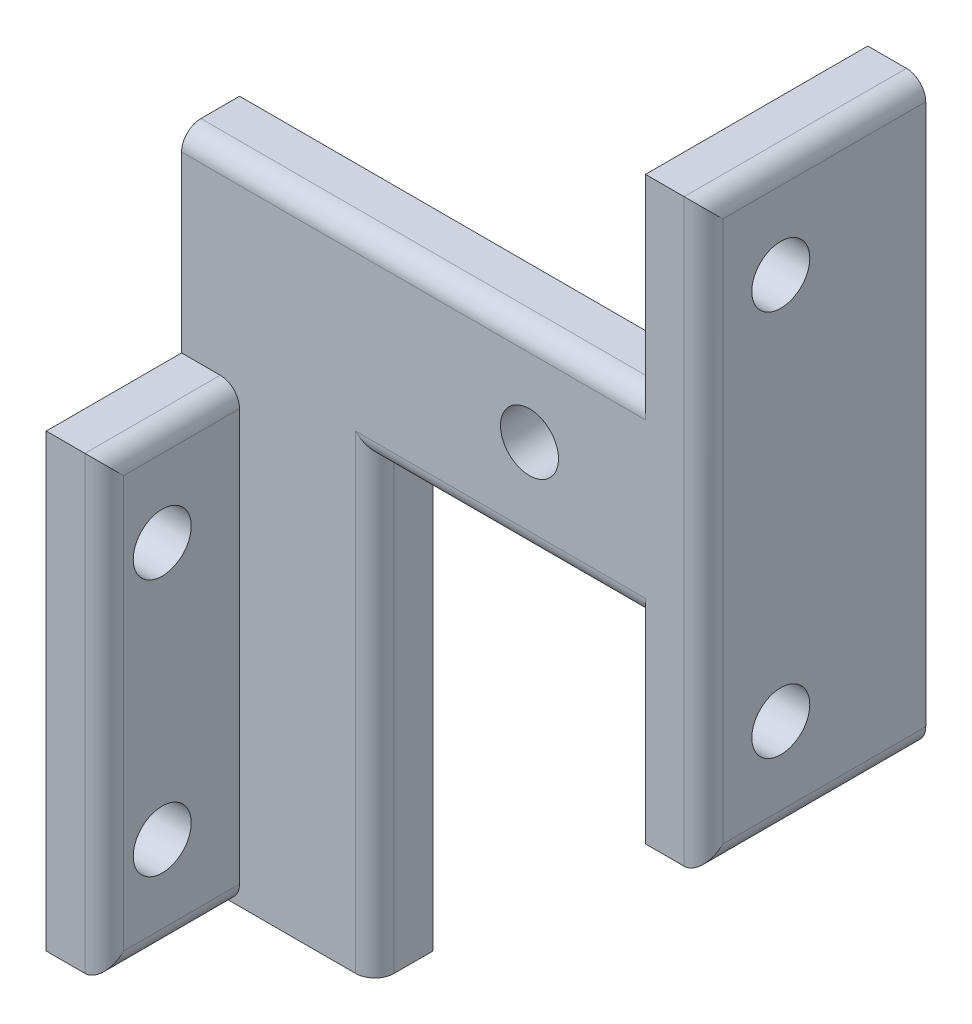
ISO-10303-21;
HEADER;
FILE_DESCRIPTION(('STEP AP214'),'2;1');
FILE_NAME('part.step','',(''),(''),'','','');
FILE_SCHEMA(('AUTOMOTIVE_DESIGN { 1 0 10303 214 1 1 1 1 }'));
ENDSEC;
DATA;
#1=APPLICATION_CONTEXT('core data for automotive mechanical design processes');
#2=APPLICATION_PROTOCOL_DEFINITION('international standard','automotive_design',2000,#1);
#3=PRODUCT_CONTEXT('',#1,'mechanical');
#4=PRODUCT('Part','Part','',(#3));
#5=PRODUCT_RELATED_PRODUCT_CATEGORY('part','',(#4));
#6=PRODUCT_DEFINITION_FORMATION('','',#4);
#7=PRODUCT_DEFINITION_CONTEXT('part definition',#1,'design');
#8=PRODUCT_DEFINITION('design','',#6,#7);
#9=PRODUCT_DEFINITION_SHAPE('','',#8);
#10=(LENGTH_UNIT() NAMED_UNIT(*) SI_UNIT(.MILLI.,.METRE.));
#11=(NAMED_UNIT(*) PLANE_ANGLE_UNIT() SI_UNIT($,.RADIAN.));
#12=(NAMED_UNIT(*) SI_UNIT($,.STERADIAN.) SOLID_ANGLE_UNIT());
#13=UNCERTAINTY_MEASURE_WITH_UNIT(LENGTH_MEASURE(1.E-05),#10,'distance_accuracy_value','');
#14=(GEOMETRIC_REPRESENTATION_CONTEXT(3) GLOBAL_UNCERTAINTY_ASSIGNED_CONTEXT((#13)) GLOBAL_UNIT_ASSIGNED_CONTEXT((#10,
#11,#12)) REPRESENTATION_CONTEXT('',''));
#15=CARTESIAN_POINT('',(0.,0.,0.));
#16=DIRECTION('',(0.,0.,1.));
#17=DIRECTION('',(1.,0.,0.));
#18=AXIS2_PLACEMENT_3D('',#15,#16,#17);
#19=CARTESIAN_POINT('',(7.,0.,23.));
#20=DIRECTION('',(0.,-1.,0.));
#21=DIRECTION('',(0.,0.,-1.));
#22=AXIS2_PLACEMENT_3D('',#19,#20,#21);
#23=PLANE('',#22);
#24=DIRECTION('',(1.,0.,0.));
#25=VECTOR('',#24,1.);
#26=CARTESIAN_POINT('',(7.,0.,11.5));
#27=LINE('',#26,#25);
#28=CARTESIAN_POINT('',(18.,0.,11.5));
#29=VERTEX_POINT('',#28);
#30=CARTESIAN_POINT('',(21.,0.,11.5));
#31=VERTEX_POINT('',#30);
#32=EDGE_CURVE('E267',#29,#31,#27,.T.);
#33=ORIENTED_EDGE('',*,*,#32,.F.);
#34=DIRECTION('',(0.,0.,1.));
#35=VECTOR('',#34,1.);
#36=CARTESIAN_POINT('',(18.,0.,23.));
#37=LINE('',#36,#35);
#38=CARTESIAN_POINT('',(18.,0.,20.));
#39=VERTEX_POINT('',#38);
#40=EDGE_CURVE('E216',#29,#39,#37,.T.);
#41=ORIENTED_EDGE('',*,*,#40,.T.);
#42=DIRECTION('',(1.,0.,0.));
#43=VECTOR('',#42,1.);
#44=CARTESIAN_POINT('',(7.,0.,20.));
#45=LINE('',#44,#43);
#46=CARTESIAN_POINT('',(-3.,0.,20.));
#47=VERTEX_POINT('',#46);
#48=EDGE_CURVE('E195',#47,#39,#45,.T.);
#49=ORIENTED_EDGE('',*,*,#48,.F.);
#50=DIRECTION('',(0.,0.,1.));
#51=VECTOR('',#50,1.);
#52=CARTESIAN_POINT('',(-3.,0.,0.));
#53=LINE('',#52,#51);
#54=CARTESIAN_POINT('',(-3.,0.,22.));
#55=VERTEX_POINT('',#54);
#56=EDGE_CURVE('E211',#47,#55,#53,.T.);
#57=ORIENTED_EDGE('',*,*,#56,.T.);
#58=DIRECTION('',(-1.,0.,0.));
#59=VECTOR('',#58,1.);
#60=CARTESIAN_POINT('',(7.,0.,22.));
#61=LINE('',#60,#59);
#62=CARTESIAN_POINT('',(21.,0.,22.));
#63=VERTEX_POINT('',#62);
#64=EDGE_CURVE('E413',#55,#63,#61,.F.);
#65=ORIENTED_EDGE('',*,*,#64,.T.);
#66=DIRECTION('',(0.,0.,1.));
#67=VECTOR('',#66,1.);
#68=CARTESIAN_POINT('',(21.,0.,23.));
#69=LINE('',#68,#67);
#70=EDGE_CURVE('E38',#31,#63,#69,.T.);
#71=ORIENTED_EDGE('',*,*,#70,.F.);
#72=EDGE_LOOP('',(#33,#41,#49,#57,#65,#71));
#73=FACE_BOUND('',#72,.T.);
#74=ADVANCED_FACE('F34',(#73),#23,.F.);
#75=CARTESIAN_POINT('',(0.,-10.,20.));
#76=DIRECTION('',(0.,-1.,0.));
#77=DIRECTION('',(0.,0.,-1.));
#78=AXIS2_PLACEMENT_3D('',#75,#76,#77);
#79=PLANE('',#78);
#80=DIRECTION('',(0.,0.,-1.));
#81=VECTOR('',#80,1.);
#82=CARTESIAN_POINT('',(18.,-10.,23.));
#83=LINE('',#82,#81);
#84=CARTESIAN_POINT('',(18.,-10.,20.));
#85=VERTEX_POINT('',#84);
#86=CARTESIAN_POINT('',(18.,-10.,11.5));
#87=VERTEX_POINT('',#86);
#88=EDGE_CURVE('E212',#85,#87,#83,.T.);
#89=ORIENTED_EDGE('',*,*,#88,.T.);
#90=DIRECTION('',(1.,0.,0.));
#91=VECTOR('',#90,1.);
#92=CARTESIAN_POINT('',(0.,-10.,11.5));
#93=LINE('',#92,#91);
#94=CARTESIAN_POINT('',(21.,-10.,11.5));
#95=VERTEX_POINT('',#94);
#96=EDGE_CURVE('E365',#87,#95,#93,.T.);
#97=ORIENTED_EDGE('',*,*,#96,.T.);
#98=DIRECTION('',(0.,0.,-1.));
#99=VECTOR('',#98,1.);
#100=CARTESIAN_POINT('',(21.,-10.,23.));
#101=LINE('',#100,#99);
#102=CARTESIAN_POINT('',(21.,-10.,22.));
#103=VERTEX_POINT('',#102);
#104=EDGE_CURVE('E226',#103,#95,#101,.T.);
#105=ORIENTED_EDGE('',*,*,#104,.F.);
#106=DIRECTION('',(1.,0.,0.));
#107=VECTOR('',#106,1.);
#108=CARTESIAN_POINT('',(7.,-10.,22.));
#109=LINE('',#108,#107);
#110=CARTESIAN_POINT('',(7.,-10.,22.));
#111=VERTEX_POINT('',#110);
#112=EDGE_CURVE('E232',#103,#111,#109,.F.);
#113=ORIENTED_EDGE('',*,*,#112,.T.);
#114=DIRECTION('',(0.,0.,-1.));
#115=VECTOR('',#114,1.);
#116=CARTESIAN_POINT('',(7.,-10.,0.));
#117=LINE('',#116,#115);
#118=CARTESIAN_POINT('',(7.,-10.,20.));
#119=VERTEX_POINT('',#118);
#120=EDGE_CURVE('E405',#111,#119,#117,.T.);
#121=ORIENTED_EDGE('',*,*,#120,.T.);
#122=DIRECTION('',(1.,0.,0.));
#123=VECTOR('',#122,1.);
#124=CARTESIAN_POINT('',(0.,-10.,20.));
#125=LINE('',#124,#123);
#126=EDGE_CURVE('E399',#119,#85,#125,.T.);
#127=ORIENTED_EDGE('',*,*,#126,.T.);
#128=EDGE_LOOP('',(#89,#97,#105,#113,#121,#127));
#129=FACE_BOUND('',#128,.T.);
#130=ADVANCED_FACE('F446',(#129),#79,.T.);
#131=CARTESIAN_POINT('',(-3.,0.,0.));
#132=DIRECTION('',(-1.,0.,0.));
#133=DIRECTION('',(0.,0.,1.));
#134=AXIS2_PLACEMENT_3D('',#131,#132,#133);
#135=PLANE('',#134);
#136=DIRECTION('',(0.,-1.,0.));
#137=VECTOR('',#136,1.);
#138=CARTESIAN_POINT('',(-3.,0.,20.));
#139=LINE('',#138,#137);
#140=CARTESIAN_POINT('',(-3.,-33.3,20.));
#141=VERTEX_POINT('',#140);
#142=EDGE_CURVE('E189',#47,#141,#139,.T.);
#143=ORIENTED_EDGE('',*,*,#142,.T.);
#144=DIRECTION('',(0.,0.,1.));
#145=VECTOR('',#144,1.);
#146=CARTESIAN_POINT('',(-3.,-33.3,0.));
#147=LINE('',#146,#145);
#148=CARTESIAN_POINT('',(-3.,-33.3,30.));
#149=VERTEX_POINT('',#148);
#150=EDGE_CURVE('E199',#141,#149,#147,.T.);
#151=ORIENTED_EDGE('',*,*,#150,.T.);
#152=DIRECTION('',(0.,-1.,0.));
#153=VECTOR('',#152,1.);
#154=CARTESIAN_POINT('',(-3.,0.,30.));
#155=LINE('',#154,#153);
#156=CARTESIAN_POINT('',(-3.,-10.,30.));
#157=VERTEX_POINT('',#156);
#158=EDGE_CURVE('E205',#157,#149,#155,.T.);
#159=ORIENTED_EDGE('',*,*,#158,.F.);
#160=DIRECTION('',(0.,0.,-1.));
#161=VECTOR('',#160,1.);
#162=CARTESIAN_POINT('',(-3.,-10.,30.));
#163=LINE('',#162,#161);
#164=CARTESIAN_POINT('',(-3.,-10.,23.));
#165=VERTEX_POINT('',#164);
#166=EDGE_CURVE('E297',#157,#165,#163,.T.);
#167=ORIENTED_EDGE('',*,*,#166,.T.);
#168=DIRECTION('',(0.,1.,0.));
#169=VECTOR('',#168,1.);
#170=CARTESIAN_POINT('',(-3.,0.,23.));
#171=LINE('',#170,#169);
#172=CARTESIAN_POINT('',(-3.,-1.,23.));
#173=VERTEX_POINT('',#172);
#174=EDGE_CURVE('E504',#165,#173,#171,.T.);
#175=ORIENTED_EDGE('',*,*,#174,.T.);
#176=CARTESIAN_POINT('',(-3.,-1.,22.));
#177=DIRECTION('',(-1.,0.,0.));
#178=DIRECTION('',(0.,0.,1.));
#179=AXIS2_PLACEMENT_3D('',#176,#177,#178);
#180=CIRCLE('',#179,1.);
#181=EDGE_CURVE('E499',#173,#55,#180,.T.);
#182=ORIENTED_EDGE('',*,*,#181,.T.);
#183=ORIENTED_EDGE('',*,*,#56,.F.);
#184=EDGE_LOOP('',(#143,#151,#159,#167,#175,#182,#183));
#185=FACE_BOUND('',#184,.T.);
#186=CARTESIAN_POINT('',(-3.,-28.3,27.));
#187=DIRECTION('',(-1.,0.,0.));
#188=DIRECTION('',(0.,0.,1.));
#189=AXIS2_PLACEMENT_3D('',#186,#187,#188);
#190=CIRCLE('',#189,1.5);
#191=CARTESIAN_POINT('',(-3.,-28.3,28.5));
#192=VERTEX_POINT('',#191);
#193=EDGE_CURVE('E386',#192,#192,#190,.T.);
#194=ORIENTED_EDGE('',*,*,#193,.F.);
#195=EDGE_LOOP('',(#194));
#196=FACE_BOUND('',#195,.T.);
#197=CARTESIAN_POINT('',(-3.,-15.,27.));
#198=DIRECTION('',(-1.,0.,0.));
#199=DIRECTION('',(0.,0.,1.));
#200=AXIS2_PLACEMENT_3D('',#197,#198,#199);
#201=CIRCLE('',#200,1.5);
#202=CARTESIAN_POINT('',(-3.,-15.,28.5));
#203=VERTEX_POINT('',#202);
#204=EDGE_CURVE('E383',#203,#203,#201,.T.);
#205=ORIENTED_EDGE('',*,*,#204,.F.);
#206=EDGE_LOOP('',(#205));
#207=FACE_BOUND('',#206,.T.);
#208=ADVANCED_FACE('F208',(#185,#196,#207),#135,.T.);
#209=CARTESIAN_POINT('',(18.,0.,0.));
#210=DIRECTION('',(1.,0.,0.));
#211=DIRECTION('',(0.,0.,-1.));
#212=AXIS2_PLACEMENT_3D('',#209,#210,#211);
#213=PLANE('',#212);
#214=DIRECTION('',(0.,1.,0.));
#215=VECTOR('',#214,1.);
#216=CARTESIAN_POINT('',(18.,0.,11.5));
#217=LINE('',#216,#215);
#218=EDGE_CURVE('E270',#87,#29,#217,.T.);
#219=ORIENTED_EDGE('',*,*,#218,.F.);
#220=ORIENTED_EDGE('',*,*,#88,.F.);
#221=DIRECTION('',(0.,1.,0.));
#222=VECTOR('',#221,1.);
#223=CARTESIAN_POINT('',(18.,0.,20.));
#224=LINE('',#223,#222);
#225=EDGE_CURVE('E378',#85,#39,#224,.T.);
#226=ORIENTED_EDGE('',*,*,#225,.T.);
#227=ORIENTED_EDGE('',*,*,#40,.F.);
#228=EDGE_LOOP('',(#219,#220,#226,#227));
#229=FACE_BOUND('',#228,.T.);
#230=ADVANCED_FACE('F376',(#229),#213,.F.);
#231=CARTESIAN_POINT('',(21.,0.,0.));
#232=DIRECTION('',(1.,0.,0.));
#233=DIRECTION('',(0.,0.,-1.));
#234=AXIS2_PLACEMENT_3D('',#231,#232,#233);
#235=PLANE('',#234);
#236=CARTESIAN_POINT('',(21.,-15.,19.));
#237=DIRECTION('',(1.,0.,0.));
#238=DIRECTION('',(0.,0.,-1.));
#239=AXIS2_PLACEMENT_3D('',#236,#237,#238);
#240=CIRCLE('',#239,1.5);
#241=CARTESIAN_POINT('',(21.,-15.,17.5));
#242=VERTEX_POINT('',#241);
#243=EDGE_CURVE('E278',#242,#242,#240,.T.);
#244=ORIENTED_EDGE('',*,*,#243,.T.);
#245=EDGE_LOOP('',(#244));
#246=FACE_BOUND('',#245,.T.);
#247=DIRECTION('',(0.,1.,0.));
#248=VECTOR('',#247,1.);
#249=CARTESIAN_POINT('',(21.,0.,11.5));
#250=LINE('',#249,#248);
#251=CARTESIAN_POINT('',(21.,-20.,11.5));
#252=VERTEX_POINT('',#251);
#253=EDGE_CURVE('E318',#252,#95,#250,.T.);
#254=ORIENTED_EDGE('',*,*,#253,.F.);
#255=DIRECTION('',(0.,0.,-1.));
#256=VECTOR('',#255,1.);
#257=CARTESIAN_POINT('',(21.,-20.,0.));
#258=LINE('',#257,#256);
#259=CARTESIAN_POINT('',(21.,-20.,23.));
#260=VERTEX_POINT('',#259);
#261=EDGE_CURVE('E287',#260,#252,#258,.T.);
#262=ORIENTED_EDGE('',*,*,#261,.F.);
#263=DIRECTION('',(0.,1.,0.));
#264=VECTOR('',#263,1.);
#265=CARTESIAN_POINT('',(21.,0.,23.));
#266=LINE('',#265,#264);
#267=CARTESIAN_POINT('',(21.,-9.,23.));
#268=VERTEX_POINT('',#267);
#269=EDGE_CURVE('E293',#260,#268,#266,.T.);
#270=ORIENTED_EDGE('',*,*,#269,.T.);
#271=CARTESIAN_POINT('',(21.,-9.,22.));
#272=DIRECTION('',(1.,0.,0.));
#273=DIRECTION('',(0.,0.,-1.));
#274=AXIS2_PLACEMENT_3D('',#271,#272,#273);
#275=CIRCLE('',#274,1.);
#276=EDGE_CURVE('E44',#268,#103,#275,.T.);
#277=ORIENTED_EDGE('',*,*,#276,.T.);
#278=ORIENTED_EDGE('',*,*,#104,.T.);
#279=EDGE_LOOP('',(#254,#262,#270,#277,#278));
#280=FACE_BOUND('',#279,.T.);
#281=ADVANCED_FACE('F316',(#246,#280),#235,.F.);
#282=CARTESIAN_POINT('',(21.,5.,19.));
#283=DIRECTION('',(1.,0.,0.));
#284=DIRECTION('',(0.,0.,-1.));
#285=AXIS2_PLACEMENT_3D('',#282,#283,#284);
#286=CIRCLE('',#285,1.5);
#287=CARTESIAN_POINT('',(21.,5.,17.5));
#288=VERTEX_POINT('',#287);
#289=EDGE_CURVE('E254',#288,#288,#286,.T.);
#290=ORIENTED_EDGE('',*,*,#289,.T.);
#291=EDGE_LOOP('',(#290));
#292=FACE_BOUND('',#291,.T.);
#293=DIRECTION('',(0.,1.,0.));
#294=VECTOR('',#293,1.);
#295=CARTESIAN_POINT('',(21.,0.,11.5));
#296=LINE('',#295,#294);
#297=CARTESIAN_POINT('',(21.,10.,11.5));
#298=VERTEX_POINT('',#297);
#299=EDGE_CURVE('E262',#31,#298,#296,.T.);
#300=ORIENTED_EDGE('',*,*,#299,.F.);
#301=ORIENTED_EDGE('',*,*,#70,.T.);
#302=CARTESIAN_POINT('',(21.,-1.,22.));
#303=DIRECTION('',(1.,0.,0.));
#304=DIRECTION('',(0.,0.,-1.));
#305=AXIS2_PLACEMENT_3D('',#302,#303,#304);
#306=CIRCLE('',#305,1.);
#307=CARTESIAN_POINT('',(21.,-1.,23.));
#308=VERTEX_POINT('',#307);
#309=EDGE_CURVE('E244',#63,#308,#306,.T.);
#310=ORIENTED_EDGE('',*,*,#309,.T.);
#311=CARTESIAN_POINT('',(21.,10.,23.));
#312=VERTEX_POINT('',#311);
#313=EDGE_CURVE('E284',#308,#312,#266,.T.);
#314=ORIENTED_EDGE('',*,*,#313,.T.);
#315=DIRECTION('',(0.,0.,-1.));
#316=VECTOR('',#315,1.);
#317=CARTESIAN_POINT('',(21.,10.,0.));
#318=LINE('',#317,#316);
#319=EDGE_CURVE('E300',#312,#298,#318,.T.);
#320=ORIENTED_EDGE('',*,*,#319,.T.);
#321=EDGE_LOOP('',(#300,#301,#310,#314,#320));
#322=FACE_BOUND('',#321,.T.);
#323=ADVANCED_FACE('F442',(#292,#322),#235,.F.);
#324=CARTESIAN_POINT('',(24.,-20.,0.));
#325=DIRECTION('',(0.,1.,0.));
#326=DIRECTION('',(0.,0.,1.));
#327=AXIS2_PLACEMENT_3D('',#324,#325,#326);
#328=PLANE('',#327);
#329=DIRECTION('',(-1.,0.,0.));
#330=VECTOR('',#329,1.);
#331=CARTESIAN_POINT('',(24.,-20.,11.5));
#332=LINE('',#331,#330);
#333=CARTESIAN_POINT('',(23.,-20.,11.5));
#334=VERTEX_POINT('',#333);
#335=EDGE_CURVE('E310',#334,#252,#332,.T.);
#336=ORIENTED_EDGE('',*,*,#335,.F.);
#337=DIRECTION('',(0.,0.,-1.));
#338=VECTOR('',#337,1.);
#339=CARTESIAN_POINT('',(23.,-20.,23.));
#340=LINE('',#339,#338);
#341=CARTESIAN_POINT('',(23.,-20.,23.));
#342=VERTEX_POINT('',#341);
#343=EDGE_CURVE('E238',#334,#342,#340,.F.);
#344=ORIENTED_EDGE('',*,*,#343,.T.);
#345=DIRECTION('',(-1.,0.,0.));
#346=VECTOR('',#345,1.);
#347=CARTESIAN_POINT('',(24.,-20.,23.));
#348=LINE('',#347,#346);
#349=EDGE_CURVE('E295',#342,#260,#348,.T.);
#350=ORIENTED_EDGE('',*,*,#349,.T.);
#351=ORIENTED_EDGE('',*,*,#261,.T.);
#352=EDGE_LOOP('',(#336,#344,#350,#351));
#353=FACE_BOUND('',#352,.T.);
#354=ADVANCED_FACE('F309',(#353),#328,.F.);
#355=CARTESIAN_POINT('',(24.,10.,0.));
#356=DIRECTION('',(0.,1.,0.));
#357=DIRECTION('',(0.,0.,1.));
#358=AXIS2_PLACEMENT_3D('',#355,#356,#357);
#359=PLANE('',#358);
#360=DIRECTION('',(0.,0.,-1.));
#361=VECTOR('',#360,1.);
#362=CARTESIAN_POINT('',(23.,10.,0.));
#363=LINE('',#362,#361);
#364=CARTESIAN_POINT('',(23.,10.,23.));
#365=VERTEX_POINT('',#364);
#366=CARTESIAN_POINT('',(23.,10.,11.5));
#367=VERTEX_POINT('',#366);
#368=EDGE_CURVE('E330',#365,#367,#363,.T.);
#369=ORIENTED_EDGE('',*,*,#368,.T.);
#370=DIRECTION('',(1.,0.,0.));
#371=VECTOR('',#370,1.);
#372=CARTESIAN_POINT('',(0.,10.,11.5));
#373=LINE('',#372,#371);
#374=EDGE_CURVE('E51',#298,#367,#373,.T.);
#375=ORIENTED_EDGE('',*,*,#374,.F.);
#376=ORIENTED_EDGE('',*,*,#319,.F.);
#377=DIRECTION('',(-1.,0.,0.));
#378=VECTOR('',#377,1.);
#379=CARTESIAN_POINT('',(24.,10.,23.));
#380=LINE('',#379,#378);
#381=EDGE_CURVE('E281',#365,#312,#380,.T.);
#382=ORIENTED_EDGE('',*,*,#381,.F.);
#383=EDGE_LOOP('',(#369,#375,#376,#382));
#384=FACE_BOUND('',#383,.T.);
#385=ADVANCED_FACE('F433',(#384),#359,.T.);
#386=CARTESIAN_POINT('',(24.,0.,0.));
#387=DIRECTION('',(1.,0.,0.));
#388=DIRECTION('',(0.,0.,-1.));
#389=AXIS2_PLACEMENT_3D('',#386,#387,#388);
#390=PLANE('',#389);
#391=CARTESIAN_POINT('',(24.,-15.,19.));
#392=DIRECTION('',(1.,0.,0.));
#393=DIRECTION('',(0.,0.,-1.));
#394=AXIS2_PLACEMENT_3D('',#391,#392,#393);
#395=CIRCLE('',#394,1.5);
#396=CARTESIAN_POINT('',(24.,-15.,17.5));
#397=VERTEX_POINT('',#396);
#398=EDGE_CURVE('E277',#397,#397,#395,.T.);
#399=ORIENTED_EDGE('',*,*,#398,.F.);
#400=EDGE_LOOP('',(#399));
#401=FACE_BOUND('',#400,.T.);
#402=CARTESIAN_POINT('',(24.,5.,19.));
#403=DIRECTION('',(1.,0.,0.));
#404=DIRECTION('',(0.,0.,-1.));
#405=AXIS2_PLACEMENT_3D('',#402,#403,#404);
#406=CIRCLE('',#405,1.5);
#407=CARTESIAN_POINT('',(24.,5.,17.5));
#408=VERTEX_POINT('',#407);
#409=EDGE_CURVE('E274',#408,#408,#406,.T.);
#410=ORIENTED_EDGE('',*,*,#409,.F.);
#411=EDGE_LOOP('',(#410));
#412=FACE_BOUND('',#411,.T.);
#413=DIRECTION('',(0.,0.,-1.));
#414=VECTOR('',#413,1.);
#415=CARTESIAN_POINT('',(24.,-19.,0.));
#416=LINE('',#415,#414);
#417=CARTESIAN_POINT('',(24.,-19.,22.));
#418=VERTEX_POINT('',#417);
#419=CARTESIAN_POINT('',(24.,-19.,11.5));
#420=VERTEX_POINT('',#419);
#421=EDGE_CURVE('E338',#418,#420,#416,.T.);
#422=ORIENTED_EDGE('',*,*,#421,.T.);
#423=DIRECTION('',(0.,-1.,0.));
#424=VECTOR('',#423,1.);
#425=CARTESIAN_POINT('',(24.,10.,11.5));
#426=LINE('',#425,#424);
#427=CARTESIAN_POINT('',(24.,9.,11.5));
#428=VERTEX_POINT('',#427);
#429=EDGE_CURVE('E347',#428,#420,#426,.T.);
#430=ORIENTED_EDGE('',*,*,#429,.F.);
#431=DIRECTION('',(0.,0.,-1.));
#432=VECTOR('',#431,1.);
#433=CARTESIAN_POINT('',(24.,9.,0.));
#434=LINE('',#433,#432);
#435=CARTESIAN_POINT('',(24.,9.,22.));
#436=VERTEX_POINT('',#435);
#437=EDGE_CURVE('E230',#428,#436,#434,.F.);
#438=ORIENTED_EDGE('',*,*,#437,.T.);
#439=DIRECTION('',(0.,1.,0.));
#440=VECTOR('',#439,1.);
#441=CARTESIAN_POINT('',(24.,-20.,22.));
#442=LINE('',#441,#440);
#443=EDGE_CURVE('E340',#436,#418,#442,.F.);
#444=ORIENTED_EDGE('',*,*,#443,.T.);
#445=EDGE_LOOP('',(#422,#430,#438,#444));
#446=FACE_BOUND('',#445,.T.);
#447=ADVANCED_FACE('F346',(#401,#412,#446),#390,.T.);
#448=CARTESIAN_POINT('',(23.,-19.,0.));
#449=DIRECTION('',(0.,0.,1.));
#450=DIRECTION('',(1.,0.,0.));
#451=AXIS2_PLACEMENT_3D('',#448,#449,#450);
#452=CYLINDRICAL_SURFACE('',#451,1.);
#453=ORIENTED_EDGE('',*,*,#343,.F.);
#454=CARTESIAN_POINT('',(23.,-19.,11.5));
#455=DIRECTION('',(0.,0.,-1.));
#456=DIRECTION('',(-1.,0.,0.));
#457=AXIS2_PLACEMENT_3D('',#454,#455,#456);
#458=CIRCLE('',#457,1.);
#459=EDGE_CURVE('E358',#334,#420,#458,.F.);
#460=ORIENTED_EDGE('',*,*,#459,.T.);
#461=ORIENTED_EDGE('',*,*,#421,.F.);
#462=CARTESIAN_POINT('',(23.,-19.,22.));
#463=DIRECTION('',(0.,0.707106781186547,0.707106781186547));
#464=DIRECTION('',(0.,-0.707106781186548,0.707106781186547));
#465=AXIS2_PLACEMENT_3D('',#462,#463,#464);
#466=ELLIPSE('',#465,1.41421356237309,1.);
#467=EDGE_CURVE('E251',#342,#418,#466,.T.);
#468=ORIENTED_EDGE('',*,*,#467,.F.);
#469=EDGE_LOOP('',(#453,#460,#461,#468));
#470=FACE_BOUND('',#469,.T.);
#471=ADVANCED_FACE('F356',(#470),#452,.T.);
#472=CARTESIAN_POINT('',(23.,9.,0.));
#473=DIRECTION('',(0.,0.,-1.));
#474=DIRECTION('',(-1.,0.,0.));
#475=AXIS2_PLACEMENT_3D('',#472,#473,#474);
#476=CYLINDRICAL_SURFACE('',#475,1.);
#477=ORIENTED_EDGE('',*,*,#437,.F.);
#478=CARTESIAN_POINT('',(23.,9.,11.5));
#479=DIRECTION('',(0.,0.,-1.));
#480=DIRECTION('',(-1.,0.,0.));
#481=AXIS2_PLACEMENT_3D('',#478,#479,#480);
#482=CIRCLE('',#481,1.);
#483=EDGE_CURVE('E11',#428,#367,#482,.F.);
#484=ORIENTED_EDGE('',*,*,#483,.T.);
#485=ORIENTED_EDGE('',*,*,#368,.F.);
#486=CARTESIAN_POINT('',(23.,9.,22.));
#487=DIRECTION('',(0.,-0.707106781186548,0.707106781186547));
#488=DIRECTION('',(0.,-0.707106781186547,-0.707106781186547));
#489=AXIS2_PLACEMENT_3D('',#486,#487,#488);
#490=ELLIPSE('',#489,1.4142135623731,1.);
#491=EDGE_CURVE('E255',#365,#436,#490,.F.);
#492=ORIENTED_EDGE('',*,*,#491,.T.);
#493=EDGE_LOOP('',(#477,#484,#485,#492));
#494=FACE_BOUND('',#493,.T.);
#495=ADVANCED_FACE('F351',(#494),#476,.T.);
#496=CARTESIAN_POINT('',(7.,0.,0.));
#497=DIRECTION('',(1.,0.,0.));
#498=DIRECTION('',(0.,0.,-1.));
#499=AXIS2_PLACEMENT_3D('',#496,#497,#498);
#500=PLANE('',#499);
#501=ORIENTED_EDGE('',*,*,#120,.F.);
#502=DIRECTION('',(0.,-1.,0.));
#503=VECTOR('',#502,1.);
#504=CARTESIAN_POINT('',(7.,-33.3,22.));
#505=LINE('',#504,#503);
#506=CARTESIAN_POINT('',(7.,-33.3,22.));
#507=VERTEX_POINT('',#506);
#508=EDGE_CURVE('E234',#111,#507,#505,.T.);
#509=ORIENTED_EDGE('',*,*,#508,.T.);
#510=DIRECTION('',(0.,0.,-1.));
#511=VECTOR('',#510,1.);
#512=CARTESIAN_POINT('',(7.,-33.3,23.));
#513=LINE('',#512,#511);
#514=CARTESIAN_POINT('',(7.,-33.3,20.));
#515=VERTEX_POINT('',#514);
#516=EDGE_CURVE('E410',#507,#515,#513,.T.);
#517=ORIENTED_EDGE('',*,*,#516,.T.);
#518=DIRECTION('',(0.,1.,0.));
#519=VECTOR('',#518,1.);
#520=CARTESIAN_POINT('',(7.,-33.3,20.));
#521=LINE('',#520,#519);
#522=EDGE_CURVE('E193',#515,#119,#521,.T.);
#523=ORIENTED_EDGE('',*,*,#522,.T.);
#524=EDGE_LOOP('',(#501,#509,#517,#523));
#525=FACE_BOUND('',#524,.T.);
#526=ADVANCED_FACE('F455',(#525),#500,.T.);
#527=CARTESIAN_POINT('',(7.,0.,23.));
#528=DIRECTION('',(0.,0.,-1.));
#529=DIRECTION('',(0.,1.,0.));
#530=AXIS2_PLACEMENT_3D('',#527,#528,#529);
#531=PLANE('',#530);
#532=CARTESIAN_POINT('',(-1.,-32.3,23.));
#533=DIRECTION('',(0.,0.,-1.));
#534=DIRECTION('',(0.,1.,0.));
#535=AXIS2_PLACEMENT_3D('',#532,#533,#534);
#536=CIRCLE('',#535,1.);
#537=CARTESIAN_POINT('',(0.,-32.3,23.));
#538=VERTEX_POINT('',#537);
#539=CARTESIAN_POINT('',(-1.,-33.3,23.));
#540=VERTEX_POINT('',#539);
#541=EDGE_CURVE('E240',#538,#540,#536,.T.);
#542=ORIENTED_EDGE('',*,*,#541,.T.);
#543=DIRECTION('',(-1.,0.,0.));
#544=VECTOR('',#543,1.);
#545=CARTESIAN_POINT('',(7.,-33.3,23.));
#546=LINE('',#545,#544);
#547=CARTESIAN_POINT('',(6.,-33.3,23.));
#548=VERTEX_POINT('',#547);
#549=EDGE_CURVE('E58',#548,#540,#546,.T.);
#550=ORIENTED_EDGE('',*,*,#549,.F.);
#551=DIRECTION('',(0.,-1.,0.));
#552=VECTOR('',#551,1.);
#553=CARTESIAN_POINT('',(6.,-10.,23.));
#554=LINE('',#553,#552);
#555=CARTESIAN_POINT('',(6.,-9.,23.));
#556=VERTEX_POINT('',#555);
#557=EDGE_CURVE('E326',#548,#556,#554,.F.);
#558=ORIENTED_EDGE('',*,*,#557,.T.);
#559=DIRECTION('',(1.,0.,0.));
#560=VECTOR('',#559,1.);
#561=CARTESIAN_POINT('',(21.,-9.,23.));
#562=LINE('',#561,#560);
#563=EDGE_CURVE('E324',#556,#268,#562,.T.);
#564=ORIENTED_EDGE('',*,*,#563,.T.);
#565=ORIENTED_EDGE('',*,*,#269,.F.);
#566=ORIENTED_EDGE('',*,*,#349,.F.);
#567=DIRECTION('',(0.,1.,0.));
#568=VECTOR('',#567,1.);
#569=CARTESIAN_POINT('',(23.,10.,23.));
#570=LINE('',#569,#568);
#571=EDGE_CURVE('E332',#342,#365,#570,.T.);
#572=ORIENTED_EDGE('',*,*,#571,.T.);
#573=ORIENTED_EDGE('',*,*,#381,.T.);
#574=ORIENTED_EDGE('',*,*,#313,.F.);
#575=DIRECTION('',(-1.,0.,0.));
#576=VECTOR('',#575,1.);
#577=CARTESIAN_POINT('',(7.,-1.,23.));
#578=LINE('',#577,#576);
#579=EDGE_CURVE('E327',#308,#173,#578,.T.);
#580=ORIENTED_EDGE('',*,*,#579,.T.);
#581=ORIENTED_EDGE('',*,*,#174,.F.);
#582=DIRECTION('',(1.,0.,0.));
#583=VECTOR('',#582,1.);
#584=CARTESIAN_POINT('',(-3.,-10.,23.));
#585=LINE('',#584,#583);
#586=CARTESIAN_POINT('',(-1.,-10.,23.));
#587=VERTEX_POINT('',#586);
#588=EDGE_CURVE('E213',#165,#587,#585,.T.);
#589=ORIENTED_EDGE('',*,*,#588,.T.);
#590=CARTESIAN_POINT('',(-1.,-11.,23.));
#591=DIRECTION('',(0.,0.,-1.));
#592=DIRECTION('',(0.,1.,0.));
#593=AXIS2_PLACEMENT_3D('',#590,#591,#592);
#594=CIRCLE('',#593,1.);
#595=CARTESIAN_POINT('',(0.,-11.,23.));
#596=VERTEX_POINT('',#595);
#597=EDGE_CURVE('E242',#587,#596,#594,.T.);
#598=ORIENTED_EDGE('',*,*,#597,.T.);
#599=DIRECTION('',(0.,-1.,0.));
#600=VECTOR('',#599,1.);
#601=CARTESIAN_POINT('',(0.,0.,23.));
#602=LINE('',#601,#600);
#603=EDGE_CURVE('E409',#596,#538,#602,.T.);
#604=ORIENTED_EDGE('',*,*,#603,.T.);
#605=EDGE_LOOP('',(#542,#550,#558,#564,#565,#566,#572,#573,#574,#580,#581,#589,#598,#604));
#606=FACE_BOUND('',#605,.T.);
#607=CARTESIAN_POINT('',(15.,-5.,23.));
#608=DIRECTION('',(0.,0.,1.));
#609=DIRECTION('',(1.,0.,0.));
#610=AXIS2_PLACEMENT_3D('',#607,#608,#609);
#611=CIRCLE('',#610,1.5);
#612=CARTESIAN_POINT('',(16.5,-5.,23.));
#613=VERTEX_POINT('',#612);
#614=EDGE_CURVE('E395',#613,#613,#611,.T.);
#615=ORIENTED_EDGE('',*,*,#614,.F.);
#616=EDGE_LOOP('',(#615));
#617=FACE_BOUND('',#616,.T.);
#618=ADVANCED_FACE('F321',(#606,#617),#531,.F.);
#619=CARTESIAN_POINT('',(7.,-33.3,20.));
#620=DIRECTION('',(0.,0.,1.));
#621=DIRECTION('',(1.,0.,0.));
#622=AXIS2_PLACEMENT_3D('',#619,#620,#621);
#623=PLANE('',#622);
#624=DIRECTION('',(1.,0.,0.));
#625=VECTOR('',#624,1.);
#626=CARTESIAN_POINT('',(7.,-33.3,20.));
#627=LINE('',#626,#625);
#628=EDGE_CURVE('E183',#141,#515,#627,.T.);
#629=ORIENTED_EDGE('',*,*,#628,.F.);
#630=ORIENTED_EDGE('',*,*,#142,.F.);
#631=ORIENTED_EDGE('',*,*,#48,.T.);
#632=ORIENTED_EDGE('',*,*,#225,.F.);
#633=ORIENTED_EDGE('',*,*,#126,.F.);
#634=ORIENTED_EDGE('',*,*,#522,.F.);
#635=EDGE_LOOP('',(#629,#630,#631,#632,#633,#634));
#636=FACE_BOUND('',#635,.T.);
#637=CARTESIAN_POINT('',(15.,-5.,20.));
#638=DIRECTION('',(0.,0.,1.));
#639=DIRECTION('',(1.,0.,0.));
#640=AXIS2_PLACEMENT_3D('',#637,#638,#639);
#641=CIRCLE('',#640,1.5);
#642=CARTESIAN_POINT('',(16.5,-5.,20.));
#643=VERTEX_POINT('',#642);
#644=EDGE_CURVE('E396',#643,#643,#641,.T.);
#645=ORIENTED_EDGE('',*,*,#644,.T.);
#646=EDGE_LOOP('',(#645));
#647=FACE_BOUND('',#646,.T.);
#648=ADVANCED_FACE('F185',(#636,#647),#623,.F.);
#649=CARTESIAN_POINT('',(15.,-5.,20.));
#650=DIRECTION('',(0.,0.,1.));
#651=DIRECTION('',(1.,0.,0.));
#652=AXIS2_PLACEMENT_3D('',#649,#650,#651);
#653=CYLINDRICAL_SURFACE('',#652,1.5);
#654=ORIENTED_EDGE('',*,*,#644,.F.);
#655=EDGE_LOOP('',(#654));
#656=FACE_BOUND('',#655,.T.);
#657=ORIENTED_EDGE('',*,*,#614,.T.);
#658=EDGE_LOOP('',(#657));
#659=FACE_BOUND('',#658,.T.);
#660=ADVANCED_FACE('F522',(#656,#659),#653,.F.);
#661=CARTESIAN_POINT('',(0.,0.,0.));
#662=DIRECTION('',(-1.,0.,0.));
#663=DIRECTION('',(0.,0.,1.));
#664=AXIS2_PLACEMENT_3D('',#661,#662,#663);
#665=PLANE('',#664);
#666=DIRECTION('',(0.,-1.,0.));
#667=VECTOR('',#666,1.);
#668=CARTESIAN_POINT('',(0.,-33.3,29.));
#669=LINE('',#668,#667);
#670=CARTESIAN_POINT('',(0.,-11.,29.));
#671=VERTEX_POINT('',#670);
#672=CARTESIAN_POINT('',(0.,-32.3,29.));
#673=VERTEX_POINT('',#672);
#674=EDGE_CURVE('E422',#671,#673,#669,.T.);
#675=ORIENTED_EDGE('',*,*,#674,.T.);
#676=DIRECTION('',(0.,0.,1.));
#677=VECTOR('',#676,1.);
#678=CARTESIAN_POINT('',(0.,-32.3,0.));
#679=LINE('',#678,#677);
#680=EDGE_CURVE('E426',#673,#538,#679,.F.);
#681=ORIENTED_EDGE('',*,*,#680,.T.);
#682=ORIENTED_EDGE('',*,*,#603,.F.);
#683=DIRECTION('',(0.,0.,-1.));
#684=VECTOR('',#683,1.);
#685=CARTESIAN_POINT('',(0.,-11.,0.));
#686=LINE('',#685,#684);
#687=EDGE_CURVE('E424',#596,#671,#686,.F.);
#688=ORIENTED_EDGE('',*,*,#687,.T.);
#689=EDGE_LOOP('',(#675,#681,#682,#688));
#690=FACE_BOUND('',#689,.T.);
#691=CARTESIAN_POINT('',(0.,-15.,27.));
#692=DIRECTION('',(-1.,0.,0.));
#693=DIRECTION('',(0.,0.,1.));
#694=AXIS2_PLACEMENT_3D('',#691,#692,#693);
#695=CIRCLE('',#694,1.5);
#696=CARTESIAN_POINT('',(0.,-15.,28.5));
#697=VERTEX_POINT('',#696);
#698=EDGE_CURVE('E389',#697,#697,#695,.T.);
#699=ORIENTED_EDGE('',*,*,#698,.T.);
#700=EDGE_LOOP('',(#699));
#701=FACE_BOUND('',#700,.T.);
#702=CARTESIAN_POINT('',(0.,-28.3,27.));
#703=DIRECTION('',(-1.,0.,0.));
#704=DIRECTION('',(0.,0.,1.));
#705=AXIS2_PLACEMENT_3D('',#702,#703,#704);
#706=CIRCLE('',#705,1.5);
#707=CARTESIAN_POINT('',(0.,-28.3,28.5));
#708=VERTEX_POINT('',#707);
#709=EDGE_CURVE('E206',#708,#708,#706,.T.);
#710=ORIENTED_EDGE('',*,*,#709,.T.);
#711=EDGE_LOOP('',(#710));
#712=FACE_BOUND('',#711,.T.);
#713=ADVANCED_FACE('F519',(#690,#701,#712),#665,.F.);
#714=CARTESIAN_POINT('',(-3.,-33.3,0.));
#715=DIRECTION('',(0.,1.,0.));
#716=DIRECTION('',(0.,0.,1.));
#717=AXIS2_PLACEMENT_3D('',#714,#715,#716);
#718=PLANE('',#717);
#719=ORIENTED_EDGE('',*,*,#150,.F.);
#720=ORIENTED_EDGE('',*,*,#628,.T.);
#721=ORIENTED_EDGE('',*,*,#516,.F.);
#722=CARTESIAN_POINT('',(6.,-33.3,22.));
#723=DIRECTION('',(0.,1.,0.));
#724=DIRECTION('',(0.,0.,1.));
#725=AXIS2_PLACEMENT_3D('',#722,#723,#724);
#726=CIRCLE('',#725,1.);
#727=EDGE_CURVE('E236',#507,#548,#726,.F.);
#728=ORIENTED_EDGE('',*,*,#727,.T.);
#729=ORIENTED_EDGE('',*,*,#549,.T.);
#730=DIRECTION('',(0.,0.,1.));
#731=VECTOR('',#730,1.);
#732=CARTESIAN_POINT('',(-1.,-33.3,0.));
#733=LINE('',#732,#731);
#734=CARTESIAN_POINT('',(-1.,-33.3,30.));
#735=VERTEX_POINT('',#734);
#736=EDGE_CURVE('E421',#540,#735,#733,.T.);
#737=ORIENTED_EDGE('',*,*,#736,.T.);
#738=DIRECTION('',(1.,0.,0.));
#739=VECTOR('',#738,1.);
#740=CARTESIAN_POINT('',(-3.,-33.3,30.));
#741=LINE('',#740,#739);
#742=EDGE_CURVE('E202',#149,#735,#741,.T.);
#743=ORIENTED_EDGE('',*,*,#742,.F.);
#744=EDGE_LOOP('',(#719,#720,#721,#728,#729,#737,#743));
#745=FACE_BOUND('',#744,.T.);
#746=ADVANCED_FACE('F200',(#745),#718,.F.);
#747=CARTESIAN_POINT('',(-3.,0.,30.));
#748=DIRECTION('',(0.,0.,1.));
#749=DIRECTION('',(0.,-1.,0.));
#750=AXIS2_PLACEMENT_3D('',#747,#748,#749);
#751=PLANE('',#750);
#752=ORIENTED_EDGE('',*,*,#742,.T.);
#753=DIRECTION('',(0.,-1.,0.));
#754=VECTOR('',#753,1.);
#755=CARTESIAN_POINT('',(-1.,-10.,30.));
#756=LINE('',#755,#754);
#757=CARTESIAN_POINT('',(-1.,-10.,30.));
#758=VERTEX_POINT('',#757);
#759=EDGE_CURVE('E430',#735,#758,#756,.F.);
#760=ORIENTED_EDGE('',*,*,#759,.T.);
#761=DIRECTION('',(1.,0.,0.));
#762=VECTOR('',#761,1.);
#763=CARTESIAN_POINT('',(-3.,-10.,30.));
#764=LINE('',#763,#762);
#765=EDGE_CURVE('E219',#157,#758,#764,.T.);
#766=ORIENTED_EDGE('',*,*,#765,.F.);
#767=ORIENTED_EDGE('',*,*,#158,.T.);
#768=EDGE_LOOP('',(#752,#760,#766,#767));
#769=FACE_BOUND('',#768,.T.);
#770=ADVANCED_FACE('F531',(#769),#751,.T.);
#771=CARTESIAN_POINT('',(-3.,-28.3,27.));
#772=DIRECTION('',(1.,0.,0.));
#773=DIRECTION('',(0.,0.,-1.));
#774=AXIS2_PLACEMENT_3D('',#771,#772,#773);
#775=CYLINDRICAL_SURFACE('',#774,1.5);
#776=ORIENTED_EDGE('',*,*,#193,.T.);
#777=EDGE_LOOP('',(#776));
#778=FACE_BOUND('',#777,.T.);
#779=ORIENTED_EDGE('',*,*,#709,.F.);
#780=EDGE_LOOP('',(#779));
#781=FACE_BOUND('',#780,.T.);
#782=ADVANCED_FACE('F528',(#778,#781),#775,.F.);
#783=CARTESIAN_POINT('',(-3.,-15.,27.));
#784=DIRECTION('',(1.,0.,0.));
#785=DIRECTION('',(0.,0.,-1.));
#786=AXIS2_PLACEMENT_3D('',#783,#784,#785);
#787=CYLINDRICAL_SURFACE('',#786,1.5);
#788=ORIENTED_EDGE('',*,*,#204,.T.);
#789=EDGE_LOOP('',(#788));
#790=FACE_BOUND('',#789,.T.);
#791=ORIENTED_EDGE('',*,*,#698,.F.);
#792=EDGE_LOOP('',(#791));
#793=FACE_BOUND('',#792,.T.);
#794=ADVANCED_FACE('F530',(#790,#793),#787,.F.);
#795=CARTESIAN_POINT('',(-3.,-10.,30.));
#796=DIRECTION('',(0.,-1.,0.));
#797=DIRECTION('',(0.,0.,-1.));
#798=AXIS2_PLACEMENT_3D('',#795,#796,#797);
#799=PLANE('',#798);
#800=ORIENTED_EDGE('',*,*,#765,.T.);
#801=DIRECTION('',(0.,0.,-1.));
#802=VECTOR('',#801,1.);
#803=CARTESIAN_POINT('',(-1.,-10.,30.));
#804=LINE('',#803,#802);
#805=EDGE_CURVE('E428',#758,#587,#804,.T.);
#806=ORIENTED_EDGE('',*,*,#805,.T.);
#807=ORIENTED_EDGE('',*,*,#588,.F.);
#808=ORIENTED_EDGE('',*,*,#166,.F.);
#809=EDGE_LOOP('',(#800,#806,#807,#808));
#810=FACE_BOUND('',#809,.T.);
#811=ADVANCED_FACE('F512',(#810),#799,.F.);
#812=CARTESIAN_POINT('',(24.,5.,19.));
#813=DIRECTION('',(-1.,0.,0.));
#814=DIRECTION('',(0.,0.,1.));
#815=AXIS2_PLACEMENT_3D('',#812,#813,#814);
#816=CYLINDRICAL_SURFACE('',#815,1.5);
#817=ORIENTED_EDGE('',*,*,#409,.T.);
#818=EDGE_LOOP('',(#817));
#819=FACE_BOUND('',#818,.T.);
#820=ORIENTED_EDGE('',*,*,#289,.F.);
#821=EDGE_LOOP('',(#820));
#822=FACE_BOUND('',#821,.T.);
#823=ADVANCED_FACE('F582',(#819,#822),#816,.F.);
#824=CARTESIAN_POINT('',(24.,-15.,19.));
#825=DIRECTION('',(-1.,0.,0.));
#826=DIRECTION('',(0.,0.,1.));
#827=AXIS2_PLACEMENT_3D('',#824,#825,#826);
#828=CYLINDRICAL_SURFACE('',#827,1.5);
#829=ORIENTED_EDGE('',*,*,#398,.T.);
#830=EDGE_LOOP('',(#829));
#831=FACE_BOUND('',#830,.T.);
#832=ORIENTED_EDGE('',*,*,#243,.F.);
#833=EDGE_LOOP('',(#832));
#834=FACE_BOUND('',#833,.T.);
#835=ADVANCED_FACE('F471',(#831,#834),#828,.F.);
#836=CARTESIAN_POINT('',(-1.,-11.,30.));
#837=DIRECTION('',(0.,0.,-1.));
#838=DIRECTION('',(-1.,0.,0.));
#839=AXIS2_PLACEMENT_3D('',#836,#837,#838);
#840=CYLINDRICAL_SURFACE('',#839,1.);
#841=ORIENTED_EDGE('',*,*,#597,.F.);
#842=ORIENTED_EDGE('',*,*,#805,.F.);
#843=CARTESIAN_POINT('',(-1.,-11.,29.));
#844=DIRECTION('',(0.,0.707106781186547,-0.707106781186548));
#845=DIRECTION('',(0.,0.707106781186548,0.707106781186547));
#846=AXIS2_PLACEMENT_3D('',#843,#844,#845);
#847=ELLIPSE('',#846,1.41421356237309,1.);
#848=EDGE_CURVE('E250',#671,#758,#847,.F.);
#849=ORIENTED_EDGE('',*,*,#848,.F.);
#850=ORIENTED_EDGE('',*,*,#687,.F.);
#851=EDGE_LOOP('',(#841,#842,#849,#850));
#852=FACE_BOUND('',#851,.T.);
#853=ADVANCED_FACE('F467',(#852),#840,.T.);
#854=CARTESIAN_POINT('',(-1.,0.,29.));
#855=DIRECTION('',(0.,1.,0.));
#856=DIRECTION('',(0.,0.,1.));
#857=AXIS2_PLACEMENT_3D('',#854,#855,#856);
#858=CYLINDRICAL_SURFACE('',#857,1.);
#859=ORIENTED_EDGE('',*,*,#848,.T.);
#860=ORIENTED_EDGE('',*,*,#759,.F.);
#861=CARTESIAN_POINT('',(-1.,-32.3,29.));
#862=DIRECTION('',(0.,0.707106781186548,0.707106781186547));
#863=DIRECTION('',(0.,0.707106781186547,-0.707106781186548));
#864=AXIS2_PLACEMENT_3D('',#861,#862,#863);
#865=ELLIPSE('',#864,1.4142135623731,1.);
#866=EDGE_CURVE('E248',#673,#735,#865,.F.);
#867=ORIENTED_EDGE('',*,*,#866,.F.);
#868=ORIENTED_EDGE('',*,*,#674,.F.);
#869=EDGE_LOOP('',(#859,#860,#867,#868));
#870=FACE_BOUND('',#869,.T.);
#871=ADVANCED_FACE('F463',(#870),#858,.T.);
#872=CARTESIAN_POINT('',(-1.,-32.3,0.));
#873=DIRECTION('',(0.,0.,1.));
#874=DIRECTION('',(1.,0.,0.));
#875=AXIS2_PLACEMENT_3D('',#872,#873,#874);
#876=CYLINDRICAL_SURFACE('',#875,1.);
#877=ORIENTED_EDGE('',*,*,#541,.F.);
#878=ORIENTED_EDGE('',*,*,#680,.F.);
#879=ORIENTED_EDGE('',*,*,#866,.T.);
#880=ORIENTED_EDGE('',*,*,#736,.F.);
#881=EDGE_LOOP('',(#877,#878,#879,#880));
#882=FACE_BOUND('',#881,.T.);
#883=ADVANCED_FACE('F459',(#882),#876,.T.);
#884=CARTESIAN_POINT('',(7.,-1.,22.));
#885=DIRECTION('',(-1.,0.,0.));
#886=DIRECTION('',(0.,0.,1.));
#887=AXIS2_PLACEMENT_3D('',#884,#885,#886);
#888=CYLINDRICAL_SURFACE('',#887,1.);
#889=ORIENTED_EDGE('',*,*,#309,.F.);
#890=ORIENTED_EDGE('',*,*,#64,.F.);
#891=ORIENTED_EDGE('',*,*,#181,.F.);
#892=ORIENTED_EDGE('',*,*,#579,.F.);
#893=EDGE_LOOP('',(#889,#890,#891,#892));
#894=FACE_BOUND('',#893,.T.);
#895=ADVANCED_FACE('F462',(#894),#888,.T.);
#896=CARTESIAN_POINT('',(23.,0.,22.));
#897=DIRECTION('',(0.,-1.,0.));
#898=DIRECTION('',(0.,0.,-1.));
#899=AXIS2_PLACEMENT_3D('',#896,#897,#898);
#900=CYLINDRICAL_SURFACE('',#899,1.);
#901=ORIENTED_EDGE('',*,*,#467,.T.);
#902=ORIENTED_EDGE('',*,*,#443,.F.);
#903=ORIENTED_EDGE('',*,*,#491,.F.);
#904=ORIENTED_EDGE('',*,*,#571,.F.);
#905=EDGE_LOOP('',(#901,#902,#903,#904));
#906=FACE_BOUND('',#905,.T.);
#907=ADVANCED_FACE('F354',(#906),#900,.T.);
#908=CARTESIAN_POINT('',(6.,0.,22.));
#909=DIRECTION('',(0.,1.,0.));
#910=DIRECTION('',(0.,0.,1.));
#911=AXIS2_PLACEMENT_3D('',#908,#909,#910);
#912=CYLINDRICAL_SURFACE('',#911,1.);
#913=ORIENTED_EDGE('',*,*,#727,.F.);
#914=ORIENTED_EDGE('',*,*,#508,.F.);
#915=CARTESIAN_POINT('',(6.,-9.,22.));
#916=DIRECTION('',(-0.707106781186547,-0.707106781186547,0.));
#917=DIRECTION('',(-0.707106781186547,0.707106781186547,0.));
#918=AXIS2_PLACEMENT_3D('',#915,#916,#917);
#919=ELLIPSE('',#918,1.41421356237309,1.);
#920=EDGE_CURVE('E258',#556,#111,#919,.F.);
#921=ORIENTED_EDGE('',*,*,#920,.F.);
#922=ORIENTED_EDGE('',*,*,#557,.F.);
#923=EDGE_LOOP('',(#913,#914,#921,#922));
#924=FACE_BOUND('',#923,.T.);
#925=ADVANCED_FACE('F36',(#924),#912,.T.);
#926=CARTESIAN_POINT('',(7.,-9.,22.));
#927=DIRECTION('',(-1.,0.,0.));
#928=DIRECTION('',(0.,0.,1.));
#929=AXIS2_PLACEMENT_3D('',#926,#927,#928);
#930=CYLINDRICAL_SURFACE('',#929,1.);
#931=ORIENTED_EDGE('',*,*,#920,.T.);
#932=ORIENTED_EDGE('',*,*,#112,.F.);
#933=ORIENTED_EDGE('',*,*,#276,.F.);
#934=ORIENTED_EDGE('',*,*,#563,.F.);
#935=EDGE_LOOP('',(#931,#932,#933,#934));
#936=FACE_BOUND('',#935,.T.);
#937=ADVANCED_FACE('F481',(#936),#930,.T.);
#938=CARTESIAN_POINT('',(0.,10.,11.5));
#939=DIRECTION('',(0.,0.,-1.));
#940=DIRECTION('',(-1.,0.,0.));
#941=AXIS2_PLACEMENT_3D('',#938,#939,#940);
#942=PLANE('',#941);
#943=ORIENTED_EDGE('',*,*,#299,.T.);
#944=ORIENTED_EDGE('',*,*,#374,.T.);
#945=ORIENTED_EDGE('',*,*,#483,.F.);
#946=ORIENTED_EDGE('',*,*,#429,.T.);
#947=ORIENTED_EDGE('',*,*,#459,.F.);
#948=ORIENTED_EDGE('',*,*,#335,.T.);
#949=ORIENTED_EDGE('',*,*,#253,.T.);
#950=ORIENTED_EDGE('',*,*,#96,.F.);
#951=ORIENTED_EDGE('',*,*,#218,.T.);
#952=ORIENTED_EDGE('',*,*,#32,.T.);
#953=EDGE_LOOP('',(#943,#944,#945,#946,#947,#948,#949,#950,#951,#952));
#954=FACE_BOUND('',#953,.T.);
#955=ADVANCED_FACE('F369',(#954),#942,.T.);
#956=CLOSED_SHELL('',(#74,#130,#208,#230,#281,#323,#354,#385,#447,#471,#495,#526,#618,#648,#660,
#713,#746,#770,#782,#794,#811,#823,#835,#853,#871,#883,#895,#907,#925,#937,#955));
#957=MANIFOLD_SOLID_BREP('B2',#956);
#958=ADVANCED_BREP_SHAPE_REPRESENTATION('',(#18,#957),#14);
#959=SHAPE_DEFINITION_REPRESENTATION(#9,#958);
ENDSEC;
END-ISO-10303-21;
